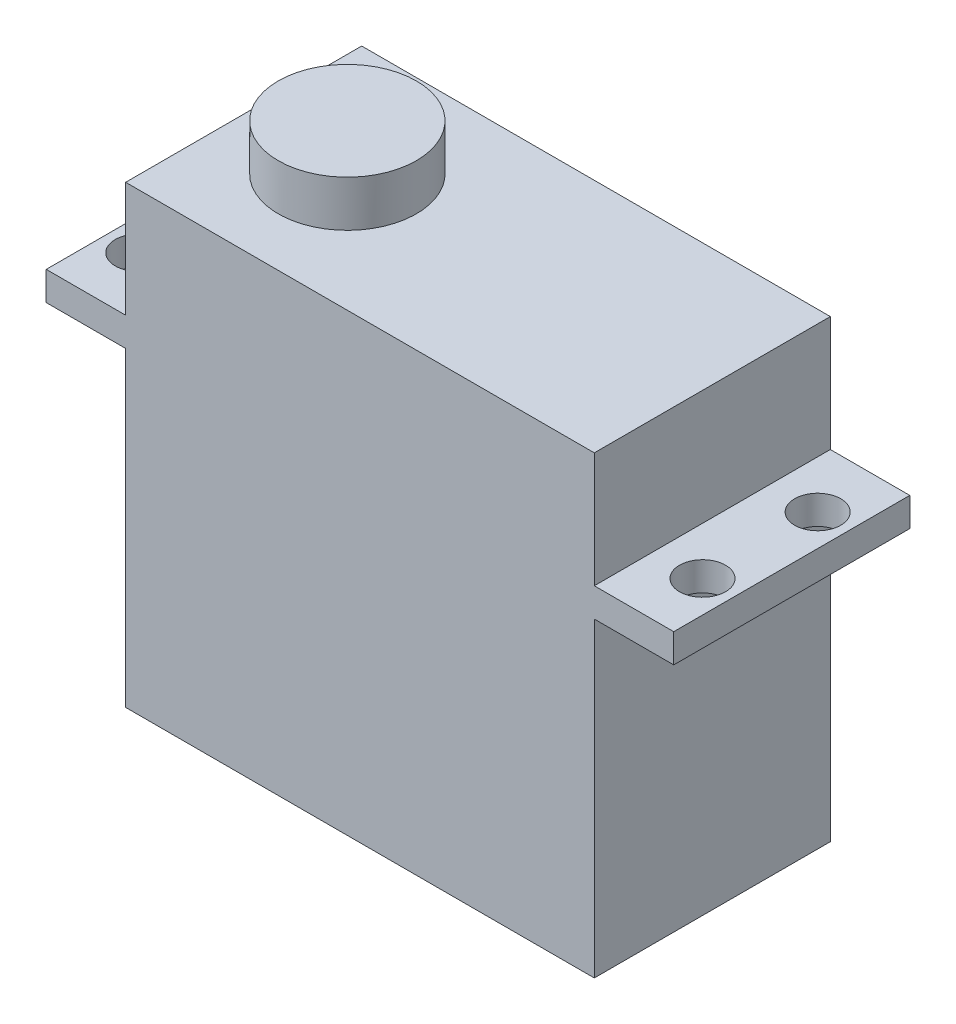
ISO-10303-21;
HEADER;
FILE_DESCRIPTION(('STEP AP214'),'2;1');
FILE_NAME('part.step','',(''),(''),'','','');
FILE_SCHEMA(('AUTOMOTIVE_DESIGN { 1 0 10303 214 1 1 1 1 }'));
ENDSEC;
DATA;
#1=APPLICATION_CONTEXT('core data for automotive mechanical design processes');
#2=APPLICATION_PROTOCOL_DEFINITION('international standard','automotive_design',2000,#1);
#3=PRODUCT_CONTEXT('',#1,'mechanical');
#4=PRODUCT('Part','Part','',(#3));
#5=PRODUCT_RELATED_PRODUCT_CATEGORY('part','',(#4));
#6=PRODUCT_DEFINITION_FORMATION('','',#4);
#7=PRODUCT_DEFINITION_CONTEXT('part definition',#1,'design');
#8=PRODUCT_DEFINITION('design','',#6,#7);
#9=PRODUCT_DEFINITION_SHAPE('','',#8);
#10=(LENGTH_UNIT() NAMED_UNIT(*) SI_UNIT(.MILLI.,.METRE.));
#11=(NAMED_UNIT(*) PLANE_ANGLE_UNIT() SI_UNIT($,.RADIAN.));
#12=(NAMED_UNIT(*) SI_UNIT($,.STERADIAN.) SOLID_ANGLE_UNIT());
#13=UNCERTAINTY_MEASURE_WITH_UNIT(LENGTH_MEASURE(1.E-05),#10,'distance_accuracy_value','');
#14=(GEOMETRIC_REPRESENTATION_CONTEXT(3) GLOBAL_UNCERTAINTY_ASSIGNED_CONTEXT((#13)) GLOBAL_UNIT_ASSIGNED_CONTEXT((#10,
#11,#12)) REPRESENTATION_CONTEXT('',''));
#15=CARTESIAN_POINT('',(0.,0.,0.));
#16=DIRECTION('',(0.,0.,1.));
#17=DIRECTION('',(1.,0.,0.));
#18=AXIS2_PLACEMENT_3D('',#15,#16,#17);
#19=CARTESIAN_POINT('',(0.,29.5,0.));
#20=DIRECTION('',(0.,-1.,0.));
#21=DIRECTION('',(0.,0.,-1.));
#22=AXIS2_PLACEMENT_3D('',#19,#20,#21);
#23=PLANE('',#22);
#24=CARTESIAN_POINT('',(-24.5,29.5,5.));
#25=DIRECTION('',(0.,1.,0.));
#26=DIRECTION('',(0.,0.,-1.));
#27=AXIS2_PLACEMENT_3D('',#24,#25,#26);
#28=CIRCLE('',#27,2.);
#29=CARTESIAN_POINT('',(-24.5,29.5,3.));
#30=VERTEX_POINT('',#29);
#31=EDGE_CURVE('E162',#30,#30,#28,.T.);
#32=ORIENTED_EDGE('',*,*,#31,.F.);
#33=EDGE_LOOP('',(#32));
#34=FACE_BOUND('',#33,.T.);
#35=CARTESIAN_POINT('',(-24.5,29.5,-5.));
#36=DIRECTION('',(0.,1.,0.));
#37=DIRECTION('',(0.,0.,1.));
#38=AXIS2_PLACEMENT_3D('',#35,#36,#37);
#39=CIRCLE('',#38,2.);
#40=CARTESIAN_POINT('',(-24.5,29.5,-3.));
#41=VERTEX_POINT('',#40);
#42=EDGE_CURVE('E168',#41,#41,#39,.T.);
#43=ORIENTED_EDGE('',*,*,#42,.F.);
#44=EDGE_LOOP('',(#43));
#45=FACE_BOUND('',#44,.T.);
#46=DIRECTION('',(0.,0.,1.));
#47=VECTOR('',#46,1.);
#48=CARTESIAN_POINT('',(-20.35,29.5,-10.25));
#49=LINE('',#48,#47);
#50=CARTESIAN_POINT('',(-20.35,29.5,-10.25));
#51=VERTEX_POINT('',#50);
#52=CARTESIAN_POINT('',(-20.35,29.5,10.25));
#53=VERTEX_POINT('',#52);
#54=EDGE_CURVE('E143',#51,#53,#49,.T.);
#55=ORIENTED_EDGE('',*,*,#54,.F.);
#56=DIRECTION('',(-1.,0.,0.));
#57=VECTOR('',#56,1.);
#58=CARTESIAN_POINT('',(-27.25,29.5,-10.25));
#59=LINE('',#58,#57);
#60=CARTESIAN_POINT('',(-27.25,29.5,-10.25));
#61=VERTEX_POINT('',#60);
#62=EDGE_CURVE('E177',#51,#61,#59,.T.);
#63=ORIENTED_EDGE('',*,*,#62,.T.);
#64=DIRECTION('',(0.,0.,1.));
#65=VECTOR('',#64,1.);
#66=CARTESIAN_POINT('',(-27.25,29.5,10.25));
#67=LINE('',#66,#65);
#68=CARTESIAN_POINT('',(-27.25,29.5,10.25));
#69=VERTEX_POINT('',#68);
#70=EDGE_CURVE('E181',#61,#69,#67,.T.);
#71=ORIENTED_EDGE('',*,*,#70,.T.);
#72=DIRECTION('',(1.,0.,0.));
#73=VECTOR('',#72,1.);
#74=CARTESIAN_POINT('',(-27.25,29.5,10.25));
#75=LINE('',#74,#73);
#76=EDGE_CURVE('E56',#69,#53,#75,.T.);
#77=ORIENTED_EDGE('',*,*,#76,.T.);
#78=EDGE_LOOP('',(#55,#63,#71,#77));
#79=FACE_BOUND('',#78,.T.);
#80=ADVANCED_FACE('F33',(#34,#45,#79),#23,.F.);
#81=CARTESIAN_POINT('',(24.5,29.5,-5.));
#82=DIRECTION('',(0.,1.,0.));
#83=DIRECTION('',(0.,0.,-1.));
#84=AXIS2_PLACEMENT_3D('',#81,#82,#83);
#85=CIRCLE('',#84,2.);
#86=CARTESIAN_POINT('',(24.5,29.5,-7.));
#87=VERTEX_POINT('',#86);
#88=EDGE_CURVE('E147',#87,#87,#85,.T.);
#89=ORIENTED_EDGE('',*,*,#88,.F.);
#90=EDGE_LOOP('',(#89));
#91=FACE_BOUND('',#90,.T.);
#92=CARTESIAN_POINT('',(24.5,29.5,5.));
#93=DIRECTION('',(0.,1.,0.));
#94=DIRECTION('',(0.,0.,1.));
#95=AXIS2_PLACEMENT_3D('',#92,#93,#94);
#96=CIRCLE('',#95,2.);
#97=CARTESIAN_POINT('',(24.5,29.5,7.));
#98=VERTEX_POINT('',#97);
#99=EDGE_CURVE('E156',#98,#98,#96,.T.);
#100=ORIENTED_EDGE('',*,*,#99,.F.);
#101=EDGE_LOOP('',(#100));
#102=FACE_BOUND('',#101,.T.);
#103=DIRECTION('',(0.,0.,-1.));
#104=VECTOR('',#103,1.);
#105=CARTESIAN_POINT('',(20.35,29.5,-10.25));
#106=LINE('',#105,#104);
#107=CARTESIAN_POINT('',(20.35,29.5,10.25));
#108=VERTEX_POINT('',#107);
#109=CARTESIAN_POINT('',(20.35,29.5,-10.25));
#110=VERTEX_POINT('',#109);
#111=EDGE_CURVE('E48',#108,#110,#106,.T.);
#112=ORIENTED_EDGE('',*,*,#111,.F.);
#113=CARTESIAN_POINT('',(27.25,29.5,10.25));
#114=VERTEX_POINT('',#113);
#115=EDGE_CURVE('E183',#108,#114,#75,.T.);
#116=ORIENTED_EDGE('',*,*,#115,.T.);
#117=DIRECTION('',(0.,0.,-1.));
#118=VECTOR('',#117,1.);
#119=CARTESIAN_POINT('',(27.25,29.5,10.25));
#120=LINE('',#119,#118);
#121=CARTESIAN_POINT('',(27.25,29.5,-10.25));
#122=VERTEX_POINT('',#121);
#123=EDGE_CURVE('E174',#114,#122,#120,.T.);
#124=ORIENTED_EDGE('',*,*,#123,.T.);
#125=EDGE_CURVE('E179',#122,#110,#59,.T.);
#126=ORIENTED_EDGE('',*,*,#125,.T.);
#127=EDGE_LOOP('',(#112,#116,#124,#126));
#128=FACE_BOUND('',#127,.T.);
#129=ADVANCED_FACE('F285',(#91,#102,#128),#23,.F.);
#130=CARTESIAN_POINT('',(20.35,27.,10.25));
#131=DIRECTION('',(-1.,0.,0.));
#132=DIRECTION('',(0.,0.,1.));
#133=AXIS2_PLACEMENT_3D('',#130,#131,#132);
#134=PLANE('',#133);
#135=DIRECTION('',(0.,0.,-1.));
#136=VECTOR('',#135,1.);
#137=CARTESIAN_POINT('',(20.35,0.,10.25));
#138=LINE('',#137,#136);
#139=CARTESIAN_POINT('',(20.35,0.,10.25));
#140=VERTEX_POINT('',#139);
#141=CARTESIAN_POINT('',(20.35,0.,-10.25));
#142=VERTEX_POINT('',#141);
#143=EDGE_CURVE('E208',#140,#142,#138,.T.);
#144=ORIENTED_EDGE('',*,*,#143,.T.);
#145=DIRECTION('',(0.,-1.,0.));
#146=VECTOR('',#145,1.);
#147=CARTESIAN_POINT('',(20.35,27.,-10.25));
#148=LINE('',#147,#146);
#149=CARTESIAN_POINT('',(20.35,27.,-10.25));
#150=VERTEX_POINT('',#149);
#151=EDGE_CURVE('E41',#150,#142,#148,.T.);
#152=ORIENTED_EDGE('',*,*,#151,.F.);
#153=DIRECTION('',(0.,0.,-1.));
#154=VECTOR('',#153,1.);
#155=CARTESIAN_POINT('',(20.35,27.,10.25));
#156=LINE('',#155,#154);
#157=CARTESIAN_POINT('',(20.35,27.,10.25));
#158=VERTEX_POINT('',#157);
#159=EDGE_CURVE('E209',#158,#150,#156,.T.);
#160=ORIENTED_EDGE('',*,*,#159,.F.);
#161=DIRECTION('',(0.,-1.,0.));
#162=VECTOR('',#161,1.);
#163=CARTESIAN_POINT('',(20.35,27.,10.25));
#164=LINE('',#163,#162);
#165=EDGE_CURVE('E216',#158,#140,#164,.T.);
#166=ORIENTED_EDGE('',*,*,#165,.T.);
#167=EDGE_LOOP('',(#144,#152,#160,#166));
#168=FACE_BOUND('',#167,.T.);
#169=ADVANCED_FACE('F35',(#168),#134,.F.);
#170=CARTESIAN_POINT('',(-20.35,27.,-10.25));
#171=DIRECTION('',(0.,0.,1.));
#172=DIRECTION('',(1.,0.,0.));
#173=AXIS2_PLACEMENT_3D('',#170,#171,#172);
#174=PLANE('',#173);
#175=DIRECTION('',(-1.,0.,0.));
#176=VECTOR('',#175,1.);
#177=CARTESIAN_POINT('',(-20.35,0.,-10.25));
#178=LINE('',#177,#176);
#179=CARTESIAN_POINT('',(-20.35,0.,-10.25));
#180=VERTEX_POINT('',#179);
#181=EDGE_CURVE('E219',#142,#180,#178,.T.);
#182=ORIENTED_EDGE('',*,*,#181,.T.);
#183=DIRECTION('',(0.,-1.,0.));
#184=VECTOR('',#183,1.);
#185=CARTESIAN_POINT('',(-20.35,27.,-10.25));
#186=LINE('',#185,#184);
#187=CARTESIAN_POINT('',(-20.35,27.,-10.25));
#188=VERTEX_POINT('',#187);
#189=EDGE_CURVE('E229',#188,#180,#186,.T.);
#190=ORIENTED_EDGE('',*,*,#189,.F.);
#191=DIRECTION('',(-1.,0.,0.));
#192=VECTOR('',#191,1.);
#193=CARTESIAN_POINT('',(-27.25,27.,-10.25));
#194=LINE('',#193,#192);
#195=CARTESIAN_POINT('',(-27.25,27.,-10.25));
#196=VERTEX_POINT('',#195);
#197=EDGE_CURVE('E188',#188,#196,#194,.T.);
#198=ORIENTED_EDGE('',*,*,#197,.T.);
#199=DIRECTION('',(0.,-1.,0.));
#200=VECTOR('',#199,1.);
#201=CARTESIAN_POINT('',(-27.25,29.5,-10.25));
#202=LINE('',#201,#200);
#203=EDGE_CURVE('E202',#61,#196,#202,.T.);
#204=ORIENTED_EDGE('',*,*,#203,.F.);
#205=ORIENTED_EDGE('',*,*,#62,.F.);
#206=DIRECTION('',(0.,-1.,0.));
#207=VECTOR('',#206,1.);
#208=CARTESIAN_POINT('',(-20.35,39.5,-10.25));
#209=LINE('',#208,#207);
#210=CARTESIAN_POINT('',(-20.35,39.5,-10.25));
#211=VERTEX_POINT('',#210);
#212=EDGE_CURVE('E256',#211,#51,#209,.T.);
#213=ORIENTED_EDGE('',*,*,#212,.F.);
#214=DIRECTION('',(-1.,0.,0.));
#215=VECTOR('',#214,1.);
#216=CARTESIAN_POINT('',(20.35,39.5,-10.25));
#217=LINE('',#216,#215);
#218=CARTESIAN_POINT('',(20.35,39.5,-10.25));
#219=VERTEX_POINT('',#218);
#220=EDGE_CURVE('E137',#219,#211,#217,.T.);
#221=ORIENTED_EDGE('',*,*,#220,.F.);
#222=DIRECTION('',(0.,-1.,0.));
#223=VECTOR('',#222,1.);
#224=CARTESIAN_POINT('',(20.35,39.5,-10.25));
#225=LINE('',#224,#223);
#226=EDGE_CURVE('E149',#219,#110,#225,.T.);
#227=ORIENTED_EDGE('',*,*,#226,.T.);
#228=ORIENTED_EDGE('',*,*,#125,.F.);
#229=DIRECTION('',(0.,-1.,0.));
#230=VECTOR('',#229,1.);
#231=CARTESIAN_POINT('',(27.25,29.5,-10.25));
#232=LINE('',#231,#230);
#233=CARTESIAN_POINT('',(27.25,27.,-10.25));
#234=VERTEX_POINT('',#233);
#235=EDGE_CURVE('E205',#122,#234,#232,.T.);
#236=ORIENTED_EDGE('',*,*,#235,.T.);
#237=EDGE_CURVE('E189',#234,#150,#194,.T.);
#238=ORIENTED_EDGE('',*,*,#237,.T.);
#239=ORIENTED_EDGE('',*,*,#151,.T.);
#240=EDGE_LOOP('',(#182,#190,#198,#204,#205,#213,#221,#227,#228,#236,#238,#239));
#241=FACE_BOUND('',#240,.T.);
#242=ADVANCED_FACE('F233',(#241),#174,.F.);
#243=CARTESIAN_POINT('',(-20.35,27.,10.25));
#244=DIRECTION('',(1.,0.,0.));
#245=DIRECTION('',(0.,0.,-1.));
#246=AXIS2_PLACEMENT_3D('',#243,#244,#245);
#247=PLANE('',#246);
#248=DIRECTION('',(0.,0.,1.));
#249=VECTOR('',#248,1.);
#250=CARTESIAN_POINT('',(-20.35,0.,10.25));
#251=LINE('',#250,#249);
#252=CARTESIAN_POINT('',(-20.35,0.,10.25));
#253=VERTEX_POINT('',#252);
#254=EDGE_CURVE('E221',#180,#253,#251,.T.);
#255=ORIENTED_EDGE('',*,*,#254,.T.);
#256=DIRECTION('',(0.,-1.,0.));
#257=VECTOR('',#256,1.);
#258=CARTESIAN_POINT('',(-20.35,27.,10.25));
#259=LINE('',#258,#257);
#260=CARTESIAN_POINT('',(-20.35,27.,10.25));
#261=VERTEX_POINT('',#260);
#262=EDGE_CURVE('E226',#261,#253,#259,.T.);
#263=ORIENTED_EDGE('',*,*,#262,.F.);
#264=DIRECTION('',(0.,0.,1.));
#265=VECTOR('',#264,1.);
#266=CARTESIAN_POINT('',(-20.35,27.,10.25));
#267=LINE('',#266,#265);
#268=EDGE_CURVE('E212',#188,#261,#267,.T.);
#269=ORIENTED_EDGE('',*,*,#268,.F.);
#270=ORIENTED_EDGE('',*,*,#189,.T.);
#271=EDGE_LOOP('',(#255,#263,#269,#270));
#272=FACE_BOUND('',#271,.T.);
#273=ADVANCED_FACE('F242',(#272),#247,.F.);
#274=CARTESIAN_POINT('',(-20.35,27.,10.25));
#275=DIRECTION('',(0.,0.,-1.));
#276=DIRECTION('',(-1.,0.,0.));
#277=AXIS2_PLACEMENT_3D('',#274,#275,#276);
#278=PLANE('',#277);
#279=DIRECTION('',(1.,0.,0.));
#280=VECTOR('',#279,1.);
#281=CARTESIAN_POINT('',(-20.35,0.,10.25));
#282=LINE('',#281,#280);
#283=EDGE_CURVE('E213',#253,#140,#282,.T.);
#284=ORIENTED_EDGE('',*,*,#283,.T.);
#285=ORIENTED_EDGE('',*,*,#165,.F.);
#286=DIRECTION('',(1.,0.,0.));
#287=VECTOR('',#286,1.);
#288=CARTESIAN_POINT('',(-27.25,27.,10.25));
#289=LINE('',#288,#287);
#290=CARTESIAN_POINT('',(27.25,27.,10.25));
#291=VERTEX_POINT('',#290);
#292=EDGE_CURVE('E194',#158,#291,#289,.T.);
#293=ORIENTED_EDGE('',*,*,#292,.T.);
#294=DIRECTION('',(0.,-1.,0.));
#295=VECTOR('',#294,1.);
#296=CARTESIAN_POINT('',(27.25,29.5,10.25));
#297=LINE('',#296,#295);
#298=EDGE_CURVE('E185',#114,#291,#297,.T.);
#299=ORIENTED_EDGE('',*,*,#298,.F.);
#300=ORIENTED_EDGE('',*,*,#115,.F.);
#301=DIRECTION('',(0.,-1.,0.));
#302=VECTOR('',#301,1.);
#303=CARTESIAN_POINT('',(20.35,39.5,10.25));
#304=LINE('',#303,#302);
#305=CARTESIAN_POINT('',(20.35,39.5,10.25));
#306=VERTEX_POINT('',#305);
#307=EDGE_CURVE('E128',#306,#108,#304,.T.);
#308=ORIENTED_EDGE('',*,*,#307,.F.);
#309=DIRECTION('',(1.,0.,0.));
#310=VECTOR('',#309,1.);
#311=CARTESIAN_POINT('',(20.35,39.5,10.25));
#312=LINE('',#311,#310);
#313=CARTESIAN_POINT('',(-20.35,39.5,10.25));
#314=VERTEX_POINT('',#313);
#315=EDGE_CURVE('E121',#314,#306,#312,.T.);
#316=ORIENTED_EDGE('',*,*,#315,.F.);
#317=DIRECTION('',(0.,-1.,0.));
#318=VECTOR('',#317,1.);
#319=CARTESIAN_POINT('',(-20.35,39.5,10.25));
#320=LINE('',#319,#318);
#321=EDGE_CURVE('E125',#314,#53,#320,.T.);
#322=ORIENTED_EDGE('',*,*,#321,.T.);
#323=ORIENTED_EDGE('',*,*,#76,.F.);
#324=DIRECTION('',(0.,-1.,0.));
#325=VECTOR('',#324,1.);
#326=CARTESIAN_POINT('',(-27.25,29.5,10.25));
#327=LINE('',#326,#325);
#328=CARTESIAN_POINT('',(-27.25,27.,10.25));
#329=VERTEX_POINT('',#328);
#330=EDGE_CURVE('E199',#69,#329,#327,.T.);
#331=ORIENTED_EDGE('',*,*,#330,.T.);
#332=EDGE_CURVE('E178',#329,#261,#289,.T.);
#333=ORIENTED_EDGE('',*,*,#332,.T.);
#334=ORIENTED_EDGE('',*,*,#262,.T.);
#335=EDGE_LOOP('',(#284,#285,#293,#299,#300,#308,#316,#322,#323,#331,#333,#334));
#336=FACE_BOUND('',#335,.T.);
#337=ADVANCED_FACE('F123',(#336),#278,.F.);
#338=CARTESIAN_POINT('',(0.,0.,0.));
#339=DIRECTION('',(0.,-1.,0.));
#340=DIRECTION('',(0.,0.,-1.));
#341=AXIS2_PLACEMENT_3D('',#338,#339,#340);
#342=PLANE('',#341);
#343=ORIENTED_EDGE('',*,*,#143,.F.);
#344=ORIENTED_EDGE('',*,*,#283,.F.);
#345=ORIENTED_EDGE('',*,*,#254,.F.);
#346=ORIENTED_EDGE('',*,*,#181,.F.);
#347=EDGE_LOOP('',(#343,#344,#345,#346));
#348=FACE_BOUND('',#347,.T.);
#349=ADVANCED_FACE('F239',(#348),#342,.T.);
#350=CARTESIAN_POINT('',(0.,27.,0.));
#351=DIRECTION('',(0.,-1.,0.));
#352=DIRECTION('',(0.,0.,-1.));
#353=AXIS2_PLACEMENT_3D('',#350,#351,#352);
#354=PLANE('',#353);
#355=CARTESIAN_POINT('',(24.5,27.,-5.));
#356=DIRECTION('',(0.,1.,0.));
#357=DIRECTION('',(0.,0.,-1.));
#358=AXIS2_PLACEMENT_3D('',#355,#356,#357);
#359=CIRCLE('',#358,2.);
#360=CARTESIAN_POINT('',(24.5,27.,-7.));
#361=VERTEX_POINT('',#360);
#362=EDGE_CURVE('E144',#361,#361,#359,.T.);
#363=ORIENTED_EDGE('',*,*,#362,.T.);
#364=EDGE_LOOP('',(#363));
#365=FACE_BOUND('',#364,.T.);
#366=CARTESIAN_POINT('',(24.5,27.,5.));
#367=DIRECTION('',(0.,1.,0.));
#368=DIRECTION('',(0.,0.,1.));
#369=AXIS2_PLACEMENT_3D('',#366,#367,#368);
#370=CIRCLE('',#369,2.);
#371=CARTESIAN_POINT('',(24.5,27.,7.));
#372=VERTEX_POINT('',#371);
#373=EDGE_CURVE('E154',#372,#372,#370,.T.);
#374=ORIENTED_EDGE('',*,*,#373,.T.);
#375=EDGE_LOOP('',(#374));
#376=FACE_BOUND('',#375,.T.);
#377=ORIENTED_EDGE('',*,*,#292,.F.);
#378=ORIENTED_EDGE('',*,*,#159,.T.);
#379=ORIENTED_EDGE('',*,*,#237,.F.);
#380=DIRECTION('',(0.,0.,-1.));
#381=VECTOR('',#380,1.);
#382=CARTESIAN_POINT('',(27.25,27.,10.25));
#383=LINE('',#382,#381);
#384=EDGE_CURVE('E171',#291,#234,#383,.T.);
#385=ORIENTED_EDGE('',*,*,#384,.F.);
#386=EDGE_LOOP('',(#377,#378,#379,#385));
#387=FACE_BOUND('',#386,.T.);
#388=ADVANCED_FACE('F301',(#365,#376,#387),#354,.T.);
#389=CARTESIAN_POINT('',(-24.5,27.,-5.));
#390=DIRECTION('',(0.,1.,0.));
#391=DIRECTION('',(0.,0.,1.));
#392=AXIS2_PLACEMENT_3D('',#389,#390,#391);
#393=CIRCLE('',#392,2.);
#394=CARTESIAN_POINT('',(-24.5,27.,-3.));
#395=VERTEX_POINT('',#394);
#396=EDGE_CURVE('E165',#395,#395,#393,.T.);
#397=ORIENTED_EDGE('',*,*,#396,.T.);
#398=EDGE_LOOP('',(#397));
#399=FACE_BOUND('',#398,.T.);
#400=ORIENTED_EDGE('',*,*,#197,.F.);
#401=ORIENTED_EDGE('',*,*,#268,.T.);
#402=ORIENTED_EDGE('',*,*,#332,.F.);
#403=DIRECTION('',(0.,0.,1.));
#404=VECTOR('',#403,1.);
#405=CARTESIAN_POINT('',(-27.25,27.,10.25));
#406=LINE('',#405,#404);
#407=EDGE_CURVE('E192',#196,#329,#406,.T.);
#408=ORIENTED_EDGE('',*,*,#407,.F.);
#409=EDGE_LOOP('',(#400,#401,#402,#408));
#410=FACE_BOUND('',#409,.T.);
#411=CARTESIAN_POINT('',(-24.5,27.,5.));
#412=DIRECTION('',(0.,1.,0.));
#413=DIRECTION('',(0.,0.,-1.));
#414=AXIS2_PLACEMENT_3D('',#411,#412,#413);
#415=CIRCLE('',#414,2.);
#416=CARTESIAN_POINT('',(-24.5,27.,3.));
#417=VERTEX_POINT('',#416);
#418=EDGE_CURVE('E159',#417,#417,#415,.T.);
#419=ORIENTED_EDGE('',*,*,#418,.T.);
#420=EDGE_LOOP('',(#419));
#421=FACE_BOUND('',#420,.T.);
#422=ADVANCED_FACE('F249',(#399,#410,#421),#354,.T.);
#423=CARTESIAN_POINT('',(27.25,29.5,10.25));
#424=DIRECTION('',(-1.,0.,0.));
#425=DIRECTION('',(0.,0.,1.));
#426=AXIS2_PLACEMENT_3D('',#423,#424,#425);
#427=PLANE('',#426);
#428=ORIENTED_EDGE('',*,*,#384,.T.);
#429=ORIENTED_EDGE('',*,*,#235,.F.);
#430=ORIENTED_EDGE('',*,*,#123,.F.);
#431=ORIENTED_EDGE('',*,*,#298,.T.);
#432=EDGE_LOOP('',(#428,#429,#430,#431));
#433=FACE_BOUND('',#432,.T.);
#434=ADVANCED_FACE('F300',(#433),#427,.F.);
#435=CARTESIAN_POINT('',(-27.25,29.5,10.25));
#436=DIRECTION('',(1.,0.,0.));
#437=DIRECTION('',(0.,0.,-1.));
#438=AXIS2_PLACEMENT_3D('',#435,#436,#437);
#439=PLANE('',#438);
#440=ORIENTED_EDGE('',*,*,#407,.T.);
#441=ORIENTED_EDGE('',*,*,#330,.F.);
#442=ORIENTED_EDGE('',*,*,#70,.F.);
#443=ORIENTED_EDGE('',*,*,#203,.T.);
#444=EDGE_LOOP('',(#440,#441,#442,#443));
#445=FACE_BOUND('',#444,.T.);
#446=ADVANCED_FACE('F255',(#445),#439,.F.);
#447=CARTESIAN_POINT('',(-24.5,29.5,-5.));
#448=DIRECTION('',(0.,-1.,0.));
#449=DIRECTION('',(0.,0.,-1.));
#450=AXIS2_PLACEMENT_3D('',#447,#448,#449);
#451=CYLINDRICAL_SURFACE('',#450,2.);
#452=ORIENTED_EDGE('',*,*,#42,.T.);
#453=EDGE_LOOP('',(#452));
#454=FACE_BOUND('',#453,.T.);
#455=ORIENTED_EDGE('',*,*,#396,.F.);
#456=EDGE_LOOP('',(#455));
#457=FACE_BOUND('',#456,.T.);
#458=ADVANCED_FACE('F296',(#454,#457),#451,.F.);
#459=CARTESIAN_POINT('',(-24.5,29.5,5.));
#460=DIRECTION('',(0.,-1.,0.));
#461=DIRECTION('',(0.,0.,-1.));
#462=AXIS2_PLACEMENT_3D('',#459,#460,#461);
#463=CYLINDRICAL_SURFACE('',#462,2.);
#464=ORIENTED_EDGE('',*,*,#31,.T.);
#465=EDGE_LOOP('',(#464));
#466=FACE_BOUND('',#465,.T.);
#467=ORIENTED_EDGE('',*,*,#418,.F.);
#468=EDGE_LOOP('',(#467));
#469=FACE_BOUND('',#468,.T.);
#470=ADVANCED_FACE('F388',(#466,#469),#463,.F.);
#471=CARTESIAN_POINT('',(24.5,29.5,5.));
#472=DIRECTION('',(0.,-1.,0.));
#473=DIRECTION('',(0.,0.,-1.));
#474=AXIS2_PLACEMENT_3D('',#471,#472,#473);
#475=CYLINDRICAL_SURFACE('',#474,2.);
#476=ORIENTED_EDGE('',*,*,#99,.T.);
#477=EDGE_LOOP('',(#476));
#478=FACE_BOUND('',#477,.T.);
#479=ORIENTED_EDGE('',*,*,#373,.F.);
#480=EDGE_LOOP('',(#479));
#481=FACE_BOUND('',#480,.T.);
#482=ADVANCED_FACE('F381',(#478,#481),#475,.F.);
#483=CARTESIAN_POINT('',(24.5,29.5,-5.));
#484=DIRECTION('',(0.,-1.,0.));
#485=DIRECTION('',(0.,0.,-1.));
#486=AXIS2_PLACEMENT_3D('',#483,#484,#485);
#487=CYLINDRICAL_SURFACE('',#486,2.);
#488=ORIENTED_EDGE('',*,*,#88,.T.);
#489=EDGE_LOOP('',(#488));
#490=FACE_BOUND('',#489,.T.);
#491=ORIENTED_EDGE('',*,*,#362,.F.);
#492=EDGE_LOOP('',(#491));
#493=FACE_BOUND('',#492,.T.);
#494=ADVANCED_FACE('F350',(#490,#493),#487,.F.);
#495=CARTESIAN_POINT('',(-20.35,39.5,-10.25));
#496=DIRECTION('',(1.,0.,0.));
#497=DIRECTION('',(0.,0.,-1.));
#498=AXIS2_PLACEMENT_3D('',#495,#496,#497);
#499=PLANE('',#498);
#500=ORIENTED_EDGE('',*,*,#54,.T.);
#501=ORIENTED_EDGE('',*,*,#321,.F.);
#502=DIRECTION('',(0.,0.,1.));
#503=VECTOR('',#502,1.);
#504=CARTESIAN_POINT('',(-20.35,39.5,-10.25));
#505=LINE('',#504,#503);
#506=EDGE_CURVE('E132',#211,#314,#505,.T.);
#507=ORIENTED_EDGE('',*,*,#506,.F.);
#508=ORIENTED_EDGE('',*,*,#212,.T.);
#509=EDGE_LOOP('',(#500,#501,#507,#508));
#510=FACE_BOUND('',#509,.T.);
#511=ADVANCED_FACE('F142',(#510),#499,.F.);
#512=CARTESIAN_POINT('',(20.35,39.5,-10.25));
#513=DIRECTION('',(-1.,0.,0.));
#514=DIRECTION('',(0.,0.,1.));
#515=AXIS2_PLACEMENT_3D('',#512,#513,#514);
#516=PLANE('',#515);
#517=ORIENTED_EDGE('',*,*,#111,.T.);
#518=ORIENTED_EDGE('',*,*,#226,.F.);
#519=DIRECTION('',(0.,0.,-1.));
#520=VECTOR('',#519,1.);
#521=CARTESIAN_POINT('',(20.35,39.5,-10.25));
#522=LINE('',#521,#520);
#523=EDGE_CURVE('E131',#306,#219,#522,.T.);
#524=ORIENTED_EDGE('',*,*,#523,.F.);
#525=ORIENTED_EDGE('',*,*,#307,.T.);
#526=EDGE_LOOP('',(#517,#518,#524,#525));
#527=FACE_BOUND('',#526,.T.);
#528=ADVANCED_FACE('F277',(#527),#516,.F.);
#529=CARTESIAN_POINT('',(0.,39.5,0.));
#530=DIRECTION('',(0.,-1.,0.));
#531=DIRECTION('',(0.,0.,-1.));
#532=AXIS2_PLACEMENT_3D('',#529,#530,#531);
#533=PLANE('',#532);
#534=CARTESIAN_POINT('',(-11.35,39.5,0.));
#535=DIRECTION('',(0.,-1.,0.));
#536=DIRECTION('',(0.,0.,-1.));
#537=AXIS2_PLACEMENT_3D('',#534,#535,#536);
#538=CIRCLE('',#537,6.);
#539=CARTESIAN_POINT('',(-11.35,39.5,-6.));
#540=VERTEX_POINT('',#539);
#541=EDGE_CURVE('E11',#540,#540,#538,.F.);
#542=ORIENTED_EDGE('',*,*,#541,.F.);
#543=EDGE_LOOP('',(#542));
#544=FACE_BOUND('',#543,.T.);
#545=ORIENTED_EDGE('',*,*,#506,.T.);
#546=ORIENTED_EDGE('',*,*,#315,.T.);
#547=ORIENTED_EDGE('',*,*,#523,.T.);
#548=ORIENTED_EDGE('',*,*,#220,.T.);
#549=EDGE_LOOP('',(#545,#546,#547,#548));
#550=FACE_BOUND('',#549,.T.);
#551=ADVANCED_FACE('F135',(#544,#550),#533,.F.);
#552=CARTESIAN_POINT('',(-11.35,43.5,0.));
#553=DIRECTION('',(0.,-1.,0.));
#554=DIRECTION('',(0.,0.,-1.));
#555=AXIS2_PLACEMENT_3D('',#552,#553,#554);
#556=CYLINDRICAL_SURFACE('',#555,6.);
#557=CARTESIAN_POINT('',(-11.35,43.5,0.));
#558=DIRECTION('',(0.,1.,0.));
#559=DIRECTION('',(0.,0.,1.));
#560=AXIS2_PLACEMENT_3D('',#557,#558,#559);
#561=CIRCLE('',#560,6.);
#562=CARTESIAN_POINT('',(-11.35,43.5,6.));
#563=VERTEX_POINT('',#562);
#564=EDGE_CURVE('E262',#563,#563,#561,.T.);
#565=ORIENTED_EDGE('',*,*,#564,.F.);
#566=EDGE_LOOP('',(#565));
#567=FACE_BOUND('',#566,.T.);
#568=ORIENTED_EDGE('',*,*,#541,.T.);
#569=EDGE_LOOP('',(#568));
#570=FACE_BOUND('',#569,.T.);
#571=ADVANCED_FACE('F270',(#567,#570),#556,.T.);
#572=CARTESIAN_POINT('',(-11.35,43.5,0.));
#573=DIRECTION('',(0.,1.,0.));
#574=DIRECTION('',(0.,0.,1.));
#575=AXIS2_PLACEMENT_3D('',#572,#573,#574);
#576=PLANE('',#575);
#577=ORIENTED_EDGE('',*,*,#564,.T.);
#578=EDGE_LOOP('',(#577));
#579=FACE_BOUND('',#578,.T.);
#580=ADVANCED_FACE('F268',(#579),#576,.T.);
#581=CLOSED_SHELL('',(#80,#129,#169,#242,#273,#337,#349,#388,#422,#434,#446,#458,#470,#482,#494,
#511,#528,#551,#571,#580));
#582=MANIFOLD_SOLID_BREP('B2',#581);
#583=ADVANCED_BREP_SHAPE_REPRESENTATION('',(#18,#582),#14);
#584=SHAPE_DEFINITION_REPRESENTATION(#9,#583);
ENDSEC;
END-ISO-10303-21;
